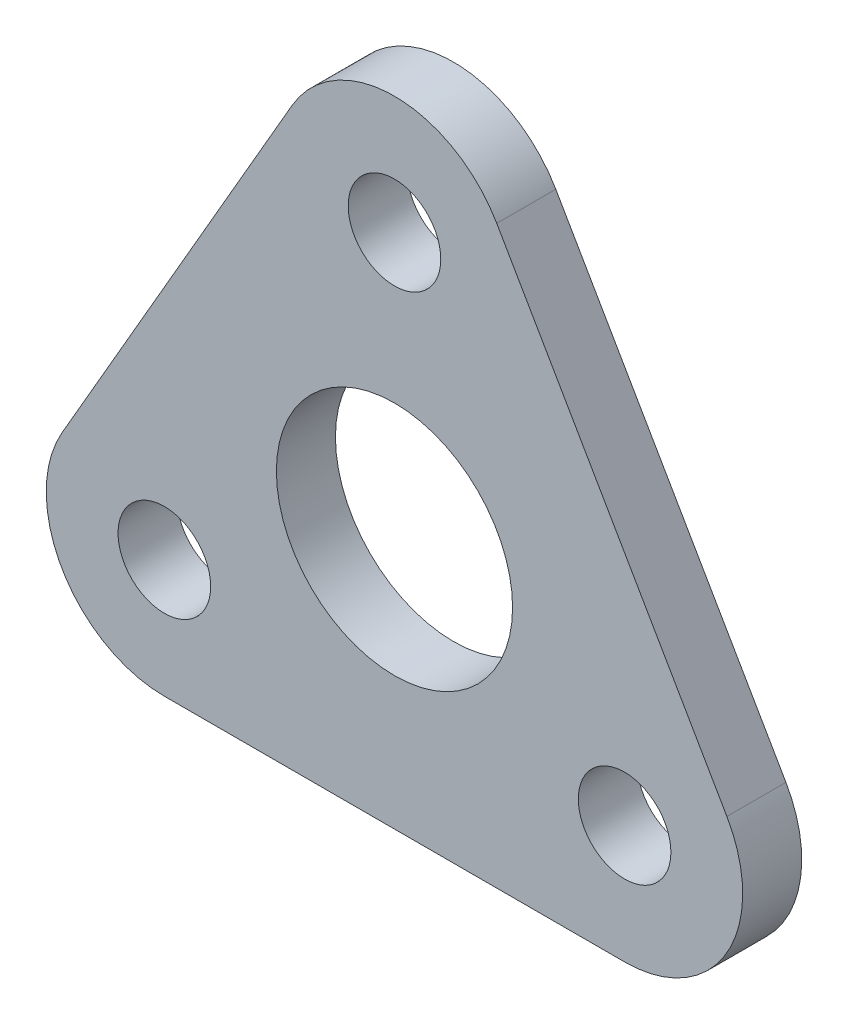
ISO-10303-21;
HEADER;
FILE_DESCRIPTION(('STEP AP214'),'2;1');
FILE_NAME('part.step','',(''),(''),'','','');
FILE_SCHEMA(('AUTOMOTIVE_DESIGN { 1 0 10303 214 1 1 1 1 }'));
ENDSEC;
DATA;
#1=APPLICATION_CONTEXT('core data for automotive mechanical design processes');
#2=APPLICATION_PROTOCOL_DEFINITION('international standard','automotive_design',2000,#1);
#3=PRODUCT_CONTEXT('',#1,'mechanical');
#4=PRODUCT('Part','Part','',(#3));
#5=PRODUCT_RELATED_PRODUCT_CATEGORY('part','',(#4));
#6=PRODUCT_DEFINITION_FORMATION('','',#4);
#7=PRODUCT_DEFINITION_CONTEXT('part definition',#1,'design');
#8=PRODUCT_DEFINITION('design','',#6,#7);
#9=PRODUCT_DEFINITION_SHAPE('','',#8);
#10=(LENGTH_UNIT() NAMED_UNIT(*) SI_UNIT(.MILLI.,.METRE.));
#11=(NAMED_UNIT(*) PLANE_ANGLE_UNIT() SI_UNIT($,.RADIAN.));
#12=(NAMED_UNIT(*) SI_UNIT($,.STERADIAN.) SOLID_ANGLE_UNIT());
#13=UNCERTAINTY_MEASURE_WITH_UNIT(LENGTH_MEASURE(1.E-05),#10,'distance_accuracy_value','');
#14=(GEOMETRIC_REPRESENTATION_CONTEXT(3) GLOBAL_UNCERTAINTY_ASSIGNED_CONTEXT((#13)) GLOBAL_UNIT_ASSIGNED_CONTEXT((#10,
#11,#12)) REPRESENTATION_CONTEXT('',''));
#15=CARTESIAN_POINT('',(0.,0.,0.));
#16=DIRECTION('',(0.,0.,1.));
#17=DIRECTION('',(1.,0.,0.));
#18=AXIS2_PLACEMENT_3D('',#15,#16,#17);
#19=CARTESIAN_POINT('',(0.,0.,3.175));
#20=DIRECTION('',(0.,0.,-1.));
#21=DIRECTION('',(-1.,0.,0.));
#22=AXIS2_PLACEMENT_3D('',#19,#20,#21);
#23=PLANE('',#22);
#24=DIRECTION('',(1.,0.,0.));
#25=VECTOR('',#24,1.);
#26=CARTESIAN_POINT('',(23.3718605846325,-13.49375,3.175));
#27=LINE('',#26,#25);
#28=CARTESIAN_POINT('',(-12.3733379565702,-13.49375,3.175));
#29=VERTEX_POINT('',#28);
#30=CARTESIAN_POINT('',(12.3733379565702,-13.49375,3.175));
#31=VERTEX_POINT('',#30);
#32=EDGE_CURVE('E119',#29,#31,#27,.T.);
#33=ORIENTED_EDGE('',*,*,#32,.T.);
#34=CARTESIAN_POINT('',(12.3733379565702,-7.14375,3.175));
#35=DIRECTION('',(0.,0.,-1.));
#36=DIRECTION('',(-1.,0.,0.));
#37=AXIS2_PLACEMENT_3D('',#34,#35,#36);
#38=CIRCLE('',#37,6.35);
#39=CARTESIAN_POINT('',(17.8725992706013,-3.96875,3.175));
#40=VERTEX_POINT('',#39);
#41=EDGE_CURVE('E134',#31,#40,#38,.F.);
#42=ORIENTED_EDGE('',*,*,#41,.T.);
#43=DIRECTION('',(-0.5,0.866025403784439,0.));
#44=VECTOR('',#43,1.);
#45=CARTESIAN_POINT('',(0.,26.9875,3.175));
#46=LINE('',#45,#44);
#47=CARTESIAN_POINT('',(5.49926131403118,17.4625,3.175));
#48=VERTEX_POINT('',#47);
#49=EDGE_CURVE('E109',#40,#48,#46,.T.);
#50=ORIENTED_EDGE('',*,*,#49,.T.);
#51=CARTESIAN_POINT('',(0.,14.2875,3.175));
#52=DIRECTION('',(0.,0.,-1.));
#53=DIRECTION('',(-1.,0.,0.));
#54=AXIS2_PLACEMENT_3D('',#51,#52,#53);
#55=CIRCLE('',#54,6.35);
#56=CARTESIAN_POINT('',(-5.49926131403118,17.4625,3.175));
#57=VERTEX_POINT('',#56);
#58=EDGE_CURVE('E57',#48,#57,#55,.F.);
#59=ORIENTED_EDGE('',*,*,#58,.T.);
#60=DIRECTION('',(-0.5,-0.866025403784439,0.));
#61=VECTOR('',#60,1.);
#62=CARTESIAN_POINT('',(-23.3718605846325,-13.49375,3.175));
#63=LINE('',#62,#61);
#64=CARTESIAN_POINT('',(-17.8725992706013,-3.96875000000001,3.175));
#65=VERTEX_POINT('',#64);
#66=EDGE_CURVE('E116',#57,#65,#63,.T.);
#67=ORIENTED_EDGE('',*,*,#66,.T.);
#68=CARTESIAN_POINT('',(-12.3733379565702,-7.14375000000001,3.175));
#69=DIRECTION('',(0.,0.,-1.));
#70=DIRECTION('',(-1.,0.,0.));
#71=AXIS2_PLACEMENT_3D('',#68,#69,#70);
#72=CIRCLE('',#71,6.35);
#73=EDGE_CURVE('E132',#65,#29,#72,.F.);
#74=ORIENTED_EDGE('',*,*,#73,.T.);
#75=EDGE_LOOP('',(#33,#42,#50,#59,#67,#74));
#76=FACE_BOUND('',#75,.T.);
#77=CARTESIAN_POINT('',(0.,0.,3.175));
#78=DIRECTION('',(0.,0.,1.));
#79=DIRECTION('',(1.,0.,0.));
#80=AXIS2_PLACEMENT_3D('',#77,#78,#79);
#81=CIRCLE('',#80,6.35);
#82=CARTESIAN_POINT('',(6.35,0.,3.175));
#83=VERTEX_POINT('',#82);
#84=EDGE_CURVE('E139',#83,#83,#81,.T.);
#85=ORIENTED_EDGE('',*,*,#84,.F.);
#86=EDGE_LOOP('',(#85));
#87=FACE_BOUND('',#86,.T.);
#88=CARTESIAN_POINT('',(0.,14.2875,3.175));
#89=DIRECTION('',(0.,0.,1.));
#90=DIRECTION('',(1.,0.,0.));
#91=AXIS2_PLACEMENT_3D('',#88,#89,#90);
#92=CIRCLE('',#91,2.4892);
#93=CARTESIAN_POINT('',(2.4892,14.2875,3.175));
#94=VERTEX_POINT('',#93);
#95=EDGE_CURVE('E148',#94,#94,#92,.T.);
#96=ORIENTED_EDGE('',*,*,#95,.F.);
#97=EDGE_LOOP('',(#96));
#98=FACE_BOUND('',#97,.T.);
#99=CARTESIAN_POINT('',(12.3733379565702,-7.14375,3.175));
#100=DIRECTION('',(0.,0.,1.));
#101=DIRECTION('',(1.,0.,0.));
#102=AXIS2_PLACEMENT_3D('',#99,#100,#101);
#103=CIRCLE('',#102,2.4892);
#104=CARTESIAN_POINT('',(14.8625379565702,-7.14375,3.175));
#105=VERTEX_POINT('',#104);
#106=EDGE_CURVE('E153',#105,#105,#103,.T.);
#107=ORIENTED_EDGE('',*,*,#106,.F.);
#108=EDGE_LOOP('',(#107));
#109=FACE_BOUND('',#108,.T.);
#110=CARTESIAN_POINT('',(-12.3733379565702,-7.14375000000001,3.175));
#111=DIRECTION('',(0.,0.,1.));
#112=DIRECTION('',(1.,0.,0.));
#113=AXIS2_PLACEMENT_3D('',#110,#111,#112);
#114=CIRCLE('',#113,2.4892);
#115=CARTESIAN_POINT('',(-9.88413795657016,-7.14375000000001,3.175));
#116=VERTEX_POINT('',#115);
#117=EDGE_CURVE('E159',#116,#116,#114,.T.);
#118=ORIENTED_EDGE('',*,*,#117,.F.);
#119=EDGE_LOOP('',(#118));
#120=FACE_BOUND('',#119,.T.);
#121=ADVANCED_FACE('F37',(#76,#87,#98,#109,#120),#23,.F.);
#122=CARTESIAN_POINT('',(0.,0.,0.));
#123=DIRECTION('',(0.,0.,-1.));
#124=DIRECTION('',(-1.,0.,0.));
#125=AXIS2_PLACEMENT_3D('',#122,#123,#124);
#126=PLANE('',#125);
#127=CARTESIAN_POINT('',(12.3733379565702,-7.14375,0.));
#128=DIRECTION('',(0.,0.,1.));
#129=DIRECTION('',(1.,0.,0.));
#130=AXIS2_PLACEMENT_3D('',#127,#128,#129);
#131=CIRCLE('',#130,2.4892);
#132=CARTESIAN_POINT('',(14.8625379565702,-7.14375,0.));
#133=VERTEX_POINT('',#132);
#134=EDGE_CURVE('E156',#133,#133,#131,.T.);
#135=ORIENTED_EDGE('',*,*,#134,.T.);
#136=EDGE_LOOP('',(#135));
#137=FACE_BOUND('',#136,.T.);
#138=CARTESIAN_POINT('',(0.,0.,0.));
#139=DIRECTION('',(0.,0.,1.));
#140=DIRECTION('',(1.,0.,0.));
#141=AXIS2_PLACEMENT_3D('',#138,#139,#140);
#142=CIRCLE('',#141,6.35);
#143=CARTESIAN_POINT('',(6.35,0.,0.));
#144=VERTEX_POINT('',#143);
#145=EDGE_CURVE('E141',#144,#144,#142,.T.);
#146=ORIENTED_EDGE('',*,*,#145,.T.);
#147=EDGE_LOOP('',(#146));
#148=FACE_BOUND('',#147,.T.);
#149=DIRECTION('',(-0.5,0.866025403784439,0.));
#150=VECTOR('',#149,1.);
#151=CARTESIAN_POINT('',(0.,26.9875,0.));
#152=LINE('',#151,#150);
#153=CARTESIAN_POINT('',(17.8725992706013,-3.96875,0.));
#154=VERTEX_POINT('',#153);
#155=CARTESIAN_POINT('',(5.49926131403118,17.4625,0.));
#156=VERTEX_POINT('',#155);
#157=EDGE_CURVE('E107',#154,#156,#152,.T.);
#158=ORIENTED_EDGE('',*,*,#157,.F.);
#159=CARTESIAN_POINT('',(12.3733379565702,-7.14375,0.));
#160=DIRECTION('',(0.,0.,-1.));
#161=DIRECTION('',(-1.,0.,0.));
#162=AXIS2_PLACEMENT_3D('',#159,#160,#161);
#163=CIRCLE('',#162,6.35);
#164=CARTESIAN_POINT('',(12.3733379565702,-13.49375,0.));
#165=VERTEX_POINT('',#164);
#166=EDGE_CURVE('E90',#154,#165,#163,.T.);
#167=ORIENTED_EDGE('',*,*,#166,.T.);
#168=DIRECTION('',(1.,0.,0.));
#169=VECTOR('',#168,1.);
#170=CARTESIAN_POINT('',(23.3718605846325,-13.49375,0.));
#171=LINE('',#170,#169);
#172=CARTESIAN_POINT('',(-12.3733379565702,-13.49375,0.));
#173=VERTEX_POINT('',#172);
#174=EDGE_CURVE('E117',#173,#165,#171,.T.);
#175=ORIENTED_EDGE('',*,*,#174,.F.);
#176=CARTESIAN_POINT('',(-12.3733379565702,-7.14375000000001,0.));
#177=DIRECTION('',(0.,0.,-1.));
#178=DIRECTION('',(-1.,0.,0.));
#179=AXIS2_PLACEMENT_3D('',#176,#177,#178);
#180=CIRCLE('',#179,6.35);
#181=CARTESIAN_POINT('',(-17.8725992706013,-3.96875000000001,0.));
#182=VERTEX_POINT('',#181);
#183=EDGE_CURVE('E101',#173,#182,#180,.T.);
#184=ORIENTED_EDGE('',*,*,#183,.T.);
#185=DIRECTION('',(-0.5,-0.866025403784439,0.));
#186=VECTOR('',#185,1.);
#187=CARTESIAN_POINT('',(-23.3718605846325,-13.49375,0.));
#188=LINE('',#187,#186);
#189=CARTESIAN_POINT('',(-5.49926131403118,17.4625,0.));
#190=VERTEX_POINT('',#189);
#191=EDGE_CURVE('E121',#190,#182,#188,.T.);
#192=ORIENTED_EDGE('',*,*,#191,.F.);
#193=CARTESIAN_POINT('',(0.,14.2875,0.));
#194=DIRECTION('',(0.,0.,-1.));
#195=DIRECTION('',(-1.,0.,0.));
#196=AXIS2_PLACEMENT_3D('',#193,#194,#195);
#197=CIRCLE('',#196,6.35);
#198=EDGE_CURVE('E110',#190,#156,#197,.T.);
#199=ORIENTED_EDGE('',*,*,#198,.T.);
#200=EDGE_LOOP('',(#158,#167,#175,#184,#192,#199));
#201=FACE_BOUND('',#200,.T.);
#202=CARTESIAN_POINT('',(0.,14.2875,0.));
#203=DIRECTION('',(0.,0.,1.));
#204=DIRECTION('',(1.,0.,0.));
#205=AXIS2_PLACEMENT_3D('',#202,#203,#204);
#206=CIRCLE('',#205,2.4892);
#207=CARTESIAN_POINT('',(2.4892,14.2875,0.));
#208=VERTEX_POINT('',#207);
#209=EDGE_CURVE('E150',#208,#208,#206,.T.);
#210=ORIENTED_EDGE('',*,*,#209,.T.);
#211=EDGE_LOOP('',(#210));
#212=FACE_BOUND('',#211,.T.);
#213=CARTESIAN_POINT('',(-12.3733379565702,-7.14375000000001,0.));
#214=DIRECTION('',(0.,0.,1.));
#215=DIRECTION('',(1.,0.,0.));
#216=AXIS2_PLACEMENT_3D('',#213,#214,#215);
#217=CIRCLE('',#216,2.4892);
#218=CARTESIAN_POINT('',(-9.88413795657016,-7.14375000000001,0.));
#219=VERTEX_POINT('',#218);
#220=EDGE_CURVE('E162',#219,#219,#217,.T.);
#221=ORIENTED_EDGE('',*,*,#220,.T.);
#222=EDGE_LOOP('',(#221));
#223=FACE_BOUND('',#222,.T.);
#224=ADVANCED_FACE('F113',(#137,#148,#201,#212,#223),#126,.T.);
#225=CARTESIAN_POINT('',(-23.3718605846325,-13.49375,3.175));
#226=DIRECTION('',(0.866025403784439,-0.5,0.));
#227=DIRECTION('',(0.5,0.866025403784439,0.));
#228=AXIS2_PLACEMENT_3D('',#225,#226,#227);
#229=PLANE('',#228);
#230=ORIENTED_EDGE('',*,*,#191,.T.);
#231=DIRECTION('',(0.,0.,-1.));
#232=VECTOR('',#231,1.);
#233=CARTESIAN_POINT('',(-17.8725992706013,-3.96875000000001,3.175));
#234=LINE('',#233,#232);
#235=EDGE_CURVE('E11',#182,#65,#234,.F.);
#236=ORIENTED_EDGE('',*,*,#235,.T.);
#237=ORIENTED_EDGE('',*,*,#66,.F.);
#238=DIRECTION('',(0.,0.,-1.));
#239=VECTOR('',#238,1.);
#240=CARTESIAN_POINT('',(-5.49926131403118,17.4625,3.175));
#241=LINE('',#240,#239);
#242=EDGE_CURVE('E45',#57,#190,#241,.T.);
#243=ORIENTED_EDGE('',*,*,#242,.T.);
#244=EDGE_LOOP('',(#230,#236,#237,#243));
#245=FACE_BOUND('',#244,.T.);
#246=ADVANCED_FACE('F137',(#245),#229,.F.);
#247=CARTESIAN_POINT('',(23.3718605846325,-13.49375,3.175));
#248=DIRECTION('',(0.,1.,0.));
#249=DIRECTION('',(0.,0.,1.));
#250=AXIS2_PLACEMENT_3D('',#247,#248,#249);
#251=PLANE('',#250);
#252=ORIENTED_EDGE('',*,*,#174,.T.);
#253=DIRECTION('',(0.,0.,-1.));
#254=VECTOR('',#253,1.);
#255=CARTESIAN_POINT('',(12.3733379565702,-13.49375,3.175));
#256=LINE('',#255,#254);
#257=EDGE_CURVE('E95',#165,#31,#256,.F.);
#258=ORIENTED_EDGE('',*,*,#257,.T.);
#259=ORIENTED_EDGE('',*,*,#32,.F.);
#260=DIRECTION('',(0.,0.,-1.));
#261=VECTOR('',#260,1.);
#262=CARTESIAN_POINT('',(-12.3733379565702,-13.49375,3.175));
#263=LINE('',#262,#261);
#264=EDGE_CURVE('E100',#29,#173,#263,.T.);
#265=ORIENTED_EDGE('',*,*,#264,.T.);
#266=EDGE_LOOP('',(#252,#258,#259,#265));
#267=FACE_BOUND('',#266,.T.);
#268=ADVANCED_FACE('F185',(#267),#251,.F.);
#269=CARTESIAN_POINT('',(0.,26.9875,3.175));
#270=DIRECTION('',(-0.866025403784439,-0.5,0.));
#271=DIRECTION('',(0.5,-0.866025403784439,0.));
#272=AXIS2_PLACEMENT_3D('',#269,#270,#271);
#273=PLANE('',#272);
#274=ORIENTED_EDGE('',*,*,#49,.F.);
#275=DIRECTION('',(0.,0.,-1.));
#276=VECTOR('',#275,1.);
#277=CARTESIAN_POINT('',(17.8725992706013,-3.96875,3.175));
#278=LINE('',#277,#276);
#279=EDGE_CURVE('E94',#40,#154,#278,.T.);
#280=ORIENTED_EDGE('',*,*,#279,.T.);
#281=ORIENTED_EDGE('',*,*,#157,.T.);
#282=DIRECTION('',(0.,0.,-1.));
#283=VECTOR('',#282,1.);
#284=CARTESIAN_POINT('',(5.49926131403118,17.4625,3.175));
#285=LINE('',#284,#283);
#286=EDGE_CURVE('E111',#156,#48,#285,.F.);
#287=ORIENTED_EDGE('',*,*,#286,.T.);
#288=EDGE_LOOP('',(#274,#280,#281,#287));
#289=FACE_BOUND('',#288,.T.);
#290=ADVANCED_FACE('F106',(#289),#273,.F.);
#291=CARTESIAN_POINT('',(0.,0.,3.175));
#292=DIRECTION('',(0.,0.,-1.));
#293=DIRECTION('',(-1.,0.,0.));
#294=AXIS2_PLACEMENT_3D('',#291,#292,#293);
#295=CYLINDRICAL_SURFACE('',#294,6.35);
#296=ORIENTED_EDGE('',*,*,#84,.T.);
#297=EDGE_LOOP('',(#296));
#298=FACE_BOUND('',#297,.T.);
#299=ORIENTED_EDGE('',*,*,#145,.F.);
#300=EDGE_LOOP('',(#299));
#301=FACE_BOUND('',#300,.T.);
#302=ADVANCED_FACE('F180',(#298,#301),#295,.F.);
#303=CARTESIAN_POINT('',(0.,14.2875,3.175));
#304=DIRECTION('',(0.,0.,-1.));
#305=DIRECTION('',(-1.,0.,0.));
#306=AXIS2_PLACEMENT_3D('',#303,#304,#305);
#307=CYLINDRICAL_SURFACE('',#306,2.4892);
#308=ORIENTED_EDGE('',*,*,#95,.T.);
#309=EDGE_LOOP('',(#308));
#310=FACE_BOUND('',#309,.T.);
#311=ORIENTED_EDGE('',*,*,#209,.F.);
#312=EDGE_LOOP('',(#311));
#313=FACE_BOUND('',#312,.T.);
#314=ADVANCED_FACE('F270',(#310,#313),#307,.F.);
#315=CARTESIAN_POINT('',(12.3733379565702,-7.14375,3.175));
#316=DIRECTION('',(0.,0.,-1.));
#317=DIRECTION('',(-1.,0.,0.));
#318=AXIS2_PLACEMENT_3D('',#315,#316,#317);
#319=CYLINDRICAL_SURFACE('',#318,2.4892);
#320=ORIENTED_EDGE('',*,*,#106,.T.);
#321=EDGE_LOOP('',(#320));
#322=FACE_BOUND('',#321,.T.);
#323=ORIENTED_EDGE('',*,*,#134,.F.);
#324=EDGE_LOOP('',(#323));
#325=FACE_BOUND('',#324,.T.);
#326=ADVANCED_FACE('F260',(#322,#325),#319,.F.);
#327=CARTESIAN_POINT('',(-12.3733379565702,-7.14375000000001,3.175));
#328=DIRECTION('',(0.,0.,-1.));
#329=DIRECTION('',(-1.,0.,0.));
#330=AXIS2_PLACEMENT_3D('',#327,#328,#329);
#331=CYLINDRICAL_SURFACE('',#330,2.4892);
#332=ORIENTED_EDGE('',*,*,#117,.T.);
#333=EDGE_LOOP('',(#332));
#334=FACE_BOUND('',#333,.T.);
#335=ORIENTED_EDGE('',*,*,#220,.F.);
#336=EDGE_LOOP('',(#335));
#337=FACE_BOUND('',#336,.T.);
#338=ADVANCED_FACE('F168',(#334,#337),#331,.F.);
#339=CARTESIAN_POINT('',(12.3733379565702,-7.14375,3.175));
#340=DIRECTION('',(0.,0.,-1.));
#341=DIRECTION('',(-1.,0.,0.));
#342=AXIS2_PLACEMENT_3D('',#339,#340,#341);
#343=CYLINDRICAL_SURFACE('',#342,6.35);
#344=ORIENTED_EDGE('',*,*,#41,.F.);
#345=ORIENTED_EDGE('',*,*,#257,.F.);
#346=ORIENTED_EDGE('',*,*,#166,.F.);
#347=ORIENTED_EDGE('',*,*,#279,.F.);
#348=EDGE_LOOP('',(#344,#345,#346,#347));
#349=FACE_BOUND('',#348,.T.);
#350=ADVANCED_FACE('F93',(#349),#343,.T.);
#351=CARTESIAN_POINT('',(-12.3733379565702,-7.14375000000001,3.175));
#352=DIRECTION('',(0.,0.,-1.));
#353=DIRECTION('',(-1.,0.,0.));
#354=AXIS2_PLACEMENT_3D('',#351,#352,#353);
#355=CYLINDRICAL_SURFACE('',#354,6.35);
#356=ORIENTED_EDGE('',*,*,#73,.F.);
#357=ORIENTED_EDGE('',*,*,#235,.F.);
#358=ORIENTED_EDGE('',*,*,#183,.F.);
#359=ORIENTED_EDGE('',*,*,#264,.F.);
#360=EDGE_LOOP('',(#356,#357,#358,#359));
#361=FACE_BOUND('',#360,.T.);
#362=ADVANCED_FACE('F192',(#361),#355,.T.);
#363=CARTESIAN_POINT('',(0.,14.2875,3.175));
#364=DIRECTION('',(0.,0.,-1.));
#365=DIRECTION('',(-1.,0.,0.));
#366=AXIS2_PLACEMENT_3D('',#363,#364,#365);
#367=CYLINDRICAL_SURFACE('',#366,6.35);
#368=ORIENTED_EDGE('',*,*,#58,.F.);
#369=ORIENTED_EDGE('',*,*,#286,.F.);
#370=ORIENTED_EDGE('',*,*,#198,.F.);
#371=ORIENTED_EDGE('',*,*,#242,.F.);
#372=EDGE_LOOP('',(#368,#369,#370,#371));
#373=FACE_BOUND('',#372,.T.);
#374=ADVANCED_FACE('F39',(#373),#367,.T.);
#375=CLOSED_SHELL('',(#121,#224,#246,#268,#290,#302,#314,#326,#338,#350,#362,#374));
#376=MANIFOLD_SOLID_BREP('B2',#375);
#377=ADVANCED_BREP_SHAPE_REPRESENTATION('',(#18,#376),#14);
#378=SHAPE_DEFINITION_REPRESENTATION(#9,#377);
ENDSEC;
END-ISO-10303-21;
